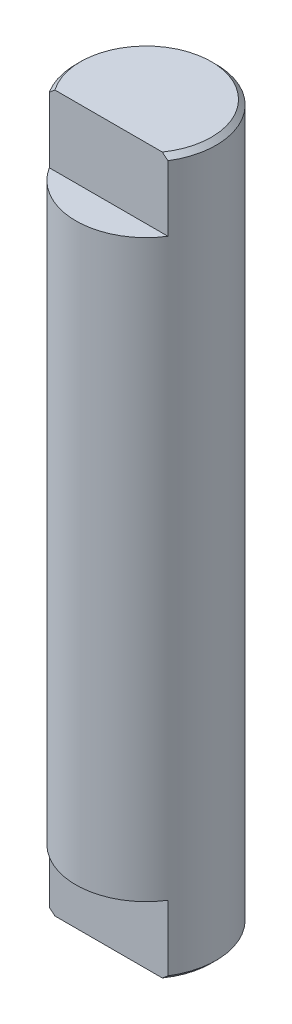
ISO-10303-21;
HEADER;
FILE_DESCRIPTION(('STEP AP214'),'2;1');
FILE_NAME('part.step','',(''),(''),'','','');
FILE_SCHEMA(('AUTOMOTIVE_DESIGN { 1 0 10303 214 1 1 1 1 }'));
ENDSEC;
DATA;
#1=APPLICATION_CONTEXT('core data for automotive mechanical design processes');
#2=APPLICATION_PROTOCOL_DEFINITION('international standard','automotive_design',2000,#1);
#3=PRODUCT_CONTEXT('',#1,'mechanical');
#4=PRODUCT('Part','Part','',(#3));
#5=PRODUCT_RELATED_PRODUCT_CATEGORY('part','',(#4));
#6=PRODUCT_DEFINITION_FORMATION('','',#4);
#7=PRODUCT_DEFINITION_CONTEXT('part definition',#1,'design');
#8=PRODUCT_DEFINITION('design','',#6,#7);
#9=PRODUCT_DEFINITION_SHAPE('','',#8);
#10=(LENGTH_UNIT() NAMED_UNIT(*) SI_UNIT(.MILLI.,.METRE.));
#11=(NAMED_UNIT(*) PLANE_ANGLE_UNIT() SI_UNIT($,.RADIAN.));
#12=(NAMED_UNIT(*) SI_UNIT($,.STERADIAN.) SOLID_ANGLE_UNIT());
#13=UNCERTAINTY_MEASURE_WITH_UNIT(LENGTH_MEASURE(1.E-05),#10,'distance_accuracy_value','');
#14=(GEOMETRIC_REPRESENTATION_CONTEXT(3) GLOBAL_UNCERTAINTY_ASSIGNED_CONTEXT((#13)) GLOBAL_UNIT_ASSIGNED_CONTEXT((#10,
#11,#12)) REPRESENTATION_CONTEXT('',''));
#15=CARTESIAN_POINT('',(0.,0.,0.));
#16=DIRECTION('',(0.,0.,1.));
#17=DIRECTION('',(1.,0.,0.));
#18=AXIS2_PLACEMENT_3D('',#15,#16,#17);
#19=CARTESIAN_POINT('',(2.53931746003125,0.362857484606989,11.1999999999786));
#20=DIRECTION('',(-1.14303049348795E-08,1.,0.));
#21=DIRECTION('',(-1.,-1.14303049348795E-08,0.));
#22=AXIS2_PLACEMENT_3D('',#19,#20,#21);
#23=PLANE('',#22);
#24=CARTESIAN_POINT('',(0.857807562780123,0.362857465386822,10.3999999999786));
#25=DIRECTION('',(-1.14303049348795E-08,1.,0.));
#26=DIRECTION('',(-1.,-1.14303049348795E-08,0.));
#27=AXIS2_PLACEMENT_3D('',#24,#25,#26);
#28=CIRCLE('',#27,1.5);
#29=CARTESIAN_POINT('',(-0.411050199266041,0.362857450883389,11.1999999999786));
#30=VERTEX_POINT('',#29);
#31=CARTESIAN_POINT('',(2.12666531682507,0.36285746538682,11.1999999999786));
#32=VERTEX_POINT('',#31);
#33=EDGE_CURVE('E19',#30,#32,#28,.T.);
#34=ORIENTED_EDGE('',*,*,#33,.T.);
#35=DIRECTION('',(1.,0.,0.));
#36=VECTOR('',#35,1.);
#37=CARTESIAN_POINT('',(2.53931746003125,0.362857450883388,11.1999999999786));
#38=LINE('',#37,#36);
#39=EDGE_CURVE('E77',#30,#32,#38,.T.);
#40=ORIENTED_EDGE('',*,*,#39,.F.);
#41=EDGE_LOOP('',(#34,#40));
#42=FACE_BOUND('',#41,.T.);
#43=ADVANCED_FACE('F16',(#42),#23,.T.);
#44=CARTESIAN_POINT('',(2.539317600624,-11.937142515393,11.1999999999786));
#45=DIRECTION('',(1.14303049348795E-08,-1.,0.));
#46=DIRECTION('',(1.,1.14303049348795E-08,0.));
#47=AXIS2_PLACEMENT_3D('',#44,#45,#46);
#48=PLANE('',#47);
#49=CARTESIAN_POINT('',(0.857807703372874,-11.9371425346132,10.3999999999786));
#50=DIRECTION('',(-1.14303049348795E-08,1.,0.));
#51=DIRECTION('',(-1.,-1.14303049348795E-08,0.));
#52=AXIS2_PLACEMENT_3D('',#49,#50,#51);
#53=CIRCLE('',#52,1.5);
#54=CARTESIAN_POINT('',(2.12666545741782,-11.9371425346132,11.1999999999786));
#55=VERTEX_POINT('',#54);
#56=CARTESIAN_POINT('',(-0.411050042670863,-11.9371425491166,11.1999999999786));
#57=VERTEX_POINT('',#56);
#58=EDGE_CURVE('E76',#55,#57,#53,.F.);
#59=ORIENTED_EDGE('',*,*,#58,.T.);
#60=DIRECTION('',(-1.,0.,0.));
#61=VECTOR('',#60,1.);
#62=CARTESIAN_POINT('',(2.539317600624,-11.9371425491166,11.1999999999786));
#63=LINE('',#62,#61);
#64=EDGE_CURVE('E252',#57,#55,#63,.F.);
#65=ORIENTED_EDGE('',*,*,#64,.T.);
#66=EDGE_LOOP('',(#59,#65));
#67=FACE_BOUND('',#66,.T.);
#68=ADVANCED_FACE('F135',(#67),#48,.T.);
#69=CARTESIAN_POINT('',(2.53931746003125,0.362857484606989,11.1999999999786));
#70=DIRECTION('',(0.,0.,1.));
#71=DIRECTION('',(0.,-1.,0.));
#72=AXIS2_PLACEMENT_3D('',#69,#70,#71);
#73=PLANE('',#72);
#74=DIRECTION('',(1.,1.14303049348795E-08,0.));
#75=VECTOR('',#74,1.);
#76=CARTESIAN_POINT('',(0.857807545634666,1.86285746538682,11.1999999999786));
#77=LINE('',#76,#75);
#78=CARTESIAN_POINT('',(2.00672007496878,1.86285747855735,11.1999999999786));
#79=VERTEX_POINT('',#78);
#80=CARTESIAN_POINT('',(-0.291104977358408,1.8628574574963,11.1999999999786));
#81=VERTEX_POINT('',#80);
#82=EDGE_CURVE('E102',#79,#81,#77,.F.);
#83=ORIENTED_EDGE('',*,*,#82,.T.);
#84=CARTESIAN_POINT('',(-0.291104971021551,1.86285746270301,11.1999999999861));
#85=CARTESIAN_POINT('',(-0.311219857834331,1.84633952365831,11.1999999999824));
#86=CARTESIAN_POINT('',(-0.331272742336284,1.82974721580447,11.1999999999799));
#87=CARTESIAN_POINT('',(-0.371254487633556,1.79641387838991,11.1999999999773));
#88=CARTESIAN_POINT('',(-0.39118334854726,1.7796728489712,11.1999999999773));
#89=CARTESIAN_POINT('',(-0.411050207268522,1.76285745088534,11.1999999999786));
#90=B_SPLINE_CURVE_WITH_KNOTS('',3,(#84,#85,#86,#87,#88,#89),.UNSPECIFIED.,.F.,.F.,(4,2,4),(0.,
0.0780820447406946,0.156164014937689),.UNSPECIFIED.);
#91=CARTESIAN_POINT('',(-0.411050207267254,1.7628574508849,11.1999999999786));
#92=VERTEX_POINT('',#91);
#93=EDGE_CURVE('E83',#81,#92,#90,.T.);
#94=ORIENTED_EDGE('',*,*,#93,.T.);
#95=DIRECTION('',(0.,-1.,0.));
#96=VECTOR('',#95,1.);
#97=CARTESIAN_POINT('',(-0.411050207267255,0.362857484606989,11.1999999999786));
#98=LINE('',#97,#96);
#99=EDGE_CURVE('E71',#92,#30,#98,.T.);
#100=ORIENTED_EDGE('',*,*,#99,.T.);
#101=ORIENTED_EDGE('',*,*,#39,.T.);
#102=DIRECTION('',(0.,-1.,0.));
#103=VECTOR('',#102,1.);
#104=CARTESIAN_POINT('',(2.12666531682507,0.362857484606989,11.1999999999786));
#105=LINE('',#104,#103);
#106=CARTESIAN_POINT('',(2.12666530768075,1.76285747505306,11.1999999981737));
#107=VERTEX_POINT('',#106);
#108=EDGE_CURVE('E74',#32,#107,#105,.F.);
#109=ORIENTED_EDGE('',*,*,#108,.T.);
#110=CARTESIAN_POINT('',(2.12666531233498,1.76285747030102,11.2000000001444));
#111=CARTESIAN_POINT('',(2.10679845339607,1.7796728677622,11.2000000000615));
#112=CARTESIAN_POINT('',(2.08686959228039,1.79641389657169,11.2000000000062));
#113=CARTESIAN_POINT('',(2.04688784661043,1.82974723279882,11.199999999951));
#114=CARTESIAN_POINT('',(2.02683496193775,1.84633954007446,11.199999999951));
#115=CARTESIAN_POINT('',(2.00672007496993,1.86285747855641,11.1999999999786));
#116=B_SPLINE_CURVE_WITH_KNOTS('',3,(#110,#111,#112,#113,#114,#115),.UNSPECIFIED.,.F.,.F.,(4,2,
4),(0.,0.0780819694853734,0.156164013514854),.UNSPECIFIED.);
#117=EDGE_CURVE('E88',#107,#79,#116,.T.);
#118=ORIENTED_EDGE('',*,*,#117,.T.);
#119=EDGE_LOOP('',(#83,#94,#100,#101,#109,#118));
#120=FACE_BOUND('',#119,.T.);
#121=ADVANCED_FACE('F82',(#120),#73,.T.);
#122=CARTESIAN_POINT('',(2.539317600624,-11.937142515393,11.1999999999786));
#123=DIRECTION('',(0.,0.,-1.));
#124=DIRECTION('',(-1.,0.,0.));
#125=AXIS2_PLACEMENT_3D('',#122,#123,#124);
#126=PLANE('',#125);
#127=CARTESIAN_POINT('',(2.12666546191234,-13.3371425296927,11.1999999998054));
#128=CARTESIAN_POINT('',(2.1067986071887,-13.3539579244062,11.199999999892));
#129=CARTESIAN_POINT('',(2.08686975028466,-13.3706989504671,11.1999999999497));
#130=CARTESIAN_POINT('',(2.04688801303089,-13.4040322811947,11.2000000000075));
#131=CARTESIAN_POINT('',(2.02683513256277,-13.4206245857195,11.2000000000075));
#132=CARTESIAN_POINT('',(2.00672024979585,-13.4371425214496,11.1999999999786));
#133=B_SPLINE_CURVE_WITH_KNOTS('',3,(#127,#128,#129,#130,#131,#132),.UNSPECIFIED.,.F.,.F.,(4,2,
4),(0.,0.0780819545070276,0.156163983557306),.UNSPECIFIED.);
#134=CARTESIAN_POINT('',(2.1266654654132,-13.3371425268555,11.1999999999786));
#135=VERTEX_POINT('',#134);
#136=CARTESIAN_POINT('',(2.00672024978554,-13.437142521458,11.1999999999786));
#137=VERTEX_POINT('',#136);
#138=EDGE_CURVE('E34',#135,#137,#133,.T.);
#139=ORIENTED_EDGE('',*,*,#138,.F.);
#140=DIRECTION('',(0.,1.,0.));
#141=VECTOR('',#140,1.);
#142=CARTESIAN_POINT('',(2.12666545741783,-11.937142515393,11.1999999999786));
#143=LINE('',#142,#141);
#144=EDGE_CURVE('E103',#55,#135,#143,.F.);
#145=ORIENTED_EDGE('',*,*,#144,.F.);
#146=ORIENTED_EDGE('',*,*,#64,.F.);
#147=DIRECTION('',(0.,1.,0.));
#148=VECTOR('',#147,1.);
#149=CARTESIAN_POINT('',(-0.41105003466965,-11.937142515393,11.1999999999786));
#150=LINE('',#149,#148);
#151=CARTESIAN_POINT('',(-0.411050034669892,-13.3371425491169,11.1999999999786));
#152=VERTEX_POINT('',#151);
#153=EDGE_CURVE('E254',#152,#57,#150,.T.);
#154=ORIENTED_EDGE('',*,*,#153,.F.);
#155=CARTESIAN_POINT('',(-0.291104821437366,-13.4371425373021,11.1999999999691));
#156=CARTESIAN_POINT('',(-0.311219704358219,-13.4206246021354,11.1999999999739));
#157=CARTESIAN_POINT('',(-0.331272584996356,-13.4040322981899,11.199999999977));
#158=CARTESIAN_POINT('',(-0.371254322622227,-13.3706989686529,11.1999999999802));
#159=CARTESIAN_POINT('',(-0.391183179728345,-13.3539579432034,11.1999999999802));
#160=CARTESIAN_POINT('',(-0.411050034670134,-13.3371425491172,11.1999999999786));
#161=B_SPLINE_CURVE_WITH_KNOTS('',3,(#155,#156,#157,#158,#159,#160),.UNSPECIFIED.,.F.,.F.,(4,2,
4),(0.,0.0780820283352844,0.156163982126894),.UNSPECIFIED.);
#162=CARTESIAN_POINT('',(-0.291104815089919,-13.4371425425191,11.1999999999786));
#163=VERTEX_POINT('',#162);
#164=EDGE_CURVE('E104',#163,#152,#161,.T.);
#165=ORIENTED_EDGE('',*,*,#164,.F.);
#166=DIRECTION('',(1.,1.14303049348795E-08,0.));
#167=VECTOR('',#166,1.);
#168=CARTESIAN_POINT('',(0.857807720518332,-13.4371425346132,11.1999999999786));
#169=LINE('',#168,#167);
#170=EDGE_CURVE('E95',#137,#163,#169,.F.);
#171=ORIENTED_EDGE('',*,*,#170,.F.);
#172=EDGE_LOOP('',(#139,#145,#146,#154,#165,#171));
#173=FACE_BOUND('',#172,.T.);
#174=ADVANCED_FACE('F109',(#173),#126,.F.);
#175=CARTESIAN_POINT('',(0.857807545634666,1.86285746538682,10.3999999999786));
#176=DIRECTION('',(1.14303049348795E-08,-1.,0.));
#177=DIRECTION('',(1.,1.14303049348795E-08,0.));
#178=AXIS2_PLACEMENT_3D('',#175,#176,#177);
#179=PLANE('',#178);
#180=CARTESIAN_POINT('',(0.857807545634666,1.8628574654258,10.3999999999786));
#181=DIRECTION('',(1.14303049090612E-08,-1.,0.));
#182=DIRECTION('',(1.,1.14303049090612E-08,0.));
#183=AXIS2_PLACEMENT_3D('',#180,#181,#182);
#184=CIRCLE('',#183,1.40000000002088);
#185=EDGE_CURVE('E92',#81,#79,#184,.T.);
#186=ORIENTED_EDGE('',*,*,#185,.F.);
#187=ORIENTED_EDGE('',*,*,#82,.F.);
#188=EDGE_LOOP('',(#186,#187));
#189=FACE_BOUND('',#188,.T.);
#190=ADVANCED_FACE('F162',(#189),#179,.F.);
#191=CARTESIAN_POINT('',(0.857807720518332,-13.4371425346132,10.3999999999786));
#192=DIRECTION('',(1.14303049348795E-08,-1.,0.));
#193=DIRECTION('',(1.,1.14303049348795E-08,0.));
#194=AXIS2_PLACEMENT_3D('',#191,#192,#193);
#195=PLANE('',#194);
#196=ORIENTED_EDGE('',*,*,#170,.T.);
#197=CARTESIAN_POINT('',(0.857807720518332,-13.4371425345989,10.3999999999786));
#198=DIRECTION('',(-1.14303051969254E-08,1.,0.));
#199=DIRECTION('',(-1.,-1.14303051969254E-08,0.));
#200=AXIS2_PLACEMENT_3D('',#197,#198,#199);
#201=CIRCLE('',#200,1.39999999995838);
#202=EDGE_CURVE('E90',#137,#163,#201,.T.);
#203=ORIENTED_EDGE('',*,*,#202,.F.);
#204=EDGE_LOOP('',(#196,#203));
#205=FACE_BOUND('',#204,.T.);
#206=ADVANCED_FACE('F123',(#205),#195,.T.);
#207=CARTESIAN_POINT('',(0.857807546777697,1.76285746545091,10.3999999999786));
#208=DIRECTION('',(1.14303049090612E-08,-1.,0.));
#209=DIRECTION('',(1.,1.14303049090612E-08,0.));
#210=AXIS2_PLACEMENT_3D('',#207,#208,#209);
#211=CONICAL_SURFACE('',#210,1.49999999993894,0.785398163113231);
#212=CARTESIAN_POINT('',(0.857807546777697,1.76285746538682,10.3999999999786));
#213=DIRECTION('',(-1.14303049348795E-08,1.,0.));
#214=DIRECTION('',(-1.,-1.14303049348795E-08,0.));
#215=AXIS2_PLACEMENT_3D('',#212,#213,#214);
#216=CIRCLE('',#215,1.5);
#217=EDGE_CURVE('E25',#92,#107,#216,.F.);
#218=ORIENTED_EDGE('',*,*,#217,.F.);
#219=ORIENTED_EDGE('',*,*,#93,.F.);
#220=ORIENTED_EDGE('',*,*,#185,.T.);
#221=ORIENTED_EDGE('',*,*,#117,.F.);
#222=EDGE_LOOP('',(#218,#219,#220,#221));
#223=FACE_BOUND('',#222,.T.);
#224=ADVANCED_FACE('F118',(#223),#211,.T.);
#225=CARTESIAN_POINT('',(0.857807719375301,-13.3371425345103,10.3999999999786));
#226=DIRECTION('',(-1.14303051969254E-08,1.,0.));
#227=DIRECTION('',(-1.,-1.14303051969254E-08,0.));
#228=AXIS2_PLACEMENT_3D('',#225,#226,#227);
#229=CONICAL_SURFACE('',#228,1.50000000010381,0.785398163681665);
#230=ORIENTED_EDGE('',*,*,#138,.T.);
#231=ORIENTED_EDGE('',*,*,#202,.T.);
#232=ORIENTED_EDGE('',*,*,#164,.T.);
#233=CARTESIAN_POINT('',(0.857807719375301,-13.3371425346132,10.3999999999786));
#234=DIRECTION('',(-1.14303049348795E-08,1.,0.));
#235=DIRECTION('',(-1.,-1.14303049348795E-08,0.));
#236=AXIS2_PLACEMENT_3D('',#233,#234,#235);
#237=CIRCLE('',#236,1.5);
#238=EDGE_CURVE('E11',#135,#152,#237,.T.);
#239=ORIENTED_EDGE('',*,*,#238,.F.);
#240=EDGE_LOOP('',(#230,#231,#232,#239));
#241=FACE_BOUND('',#240,.T.);
#242=ADVANCED_FACE('F113',(#241),#229,.T.);
#243=CARTESIAN_POINT('',(0.857807720518332,-13.4371425346132,10.3999999999786));
#244=DIRECTION('',(-1.14303049348795E-08,1.,0.));
#245=DIRECTION('',(-1.,-1.14303049348795E-08,0.));
#246=AXIS2_PLACEMENT_3D('',#243,#244,#245);
#247=CYLINDRICAL_SURFACE('',#246,1.5);
#248=ORIENTED_EDGE('',*,*,#33,.F.);
#249=ORIENTED_EDGE('',*,*,#99,.F.);
#250=ORIENTED_EDGE('',*,*,#217,.T.);
#251=ORIENTED_EDGE('',*,*,#108,.F.);
#252=EDGE_LOOP('',(#248,#249,#250,#251));
#253=FACE_BOUND('',#252,.T.);
#254=ORIENTED_EDGE('',*,*,#153,.T.);
#255=ORIENTED_EDGE('',*,*,#58,.F.);
#256=ORIENTED_EDGE('',*,*,#144,.T.);
#257=ORIENTED_EDGE('',*,*,#238,.T.);
#258=EDGE_LOOP('',(#254,#255,#256,#257));
#259=FACE_BOUND('',#258,.T.);
#260=ADVANCED_FACE('F68',(#253,#259),#247,.T.);
#261=CLOSED_SHELL('',(#43,#68,#121,#174,#190,#206,#224,#242,#260));
#262=MANIFOLD_SOLID_BREP('B1',#261);
#263=ADVANCED_BREP_SHAPE_REPRESENTATION('',(#18,#262),#14);
#264=SHAPE_DEFINITION_REPRESENTATION(#9,#263);
ENDSEC;
END-ISO-10303-21;
